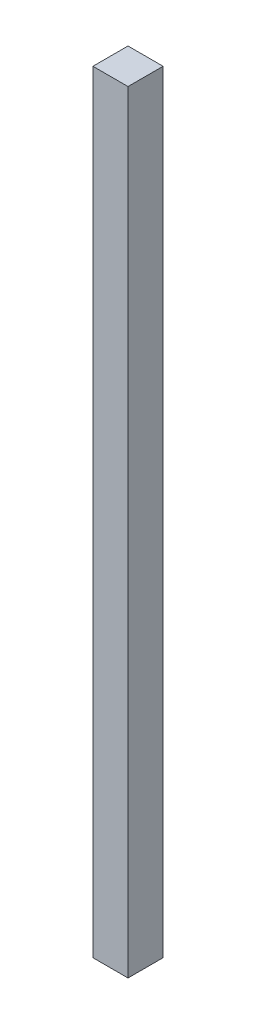
ISO-10303-21;
HEADER;
FILE_DESCRIPTION(('STEP AP214'),'2;1');
FILE_NAME('part.step','',(''),(''),'','','');
FILE_SCHEMA(('AUTOMOTIVE_DESIGN { 1 0 10303 214 1 1 1 1 }'));
ENDSEC;
DATA;
#1=APPLICATION_CONTEXT('core data for automotive mechanical design processes');
#2=APPLICATION_PROTOCOL_DEFINITION('international standard','automotive_design',2000,#1);
#3=PRODUCT_CONTEXT('',#1,'mechanical');
#4=PRODUCT('Part','Part','',(#3));
#5=PRODUCT_RELATED_PRODUCT_CATEGORY('part','',(#4));
#6=PRODUCT_DEFINITION_FORMATION('','',#4);
#7=PRODUCT_DEFINITION_CONTEXT('part definition',#1,'design');
#8=PRODUCT_DEFINITION('design','',#6,#7);
#9=PRODUCT_DEFINITION_SHAPE('','',#8);
#10=(LENGTH_UNIT() NAMED_UNIT(*) SI_UNIT(.MILLI.,.METRE.));
#11=(NAMED_UNIT(*) PLANE_ANGLE_UNIT() SI_UNIT($,.RADIAN.));
#12=(NAMED_UNIT(*) SI_UNIT($,.STERADIAN.) SOLID_ANGLE_UNIT());
#13=UNCERTAINTY_MEASURE_WITH_UNIT(LENGTH_MEASURE(1.E-05),#10,'distance_accuracy_value','');
#14=(GEOMETRIC_REPRESENTATION_CONTEXT(3) GLOBAL_UNCERTAINTY_ASSIGNED_CONTEXT((#13)) GLOBAL_UNIT_ASSIGNED_CONTEXT((#10,
#11,#12)) REPRESENTATION_CONTEXT('',''));
#15=CARTESIAN_POINT('',(0.,0.,0.));
#16=DIRECTION('',(0.,0.,1.));
#17=DIRECTION('',(1.,0.,0.));
#18=AXIS2_PLACEMENT_3D('',#15,#16,#17);
#19=CARTESIAN_POINT('',(0.,550.,0.));
#20=DIRECTION('',(1.,0.,0.));
#21=DIRECTION('',(0.,0.,-1.));
#22=AXIS2_PLACEMENT_3D('',#19,#20,#21);
#23=PLANE('',#22);
#24=DIRECTION('',(0.,0.,1.));
#25=VECTOR('',#24,1.);
#26=CARTESIAN_POINT('',(0.,0.,0.));
#27=LINE('',#26,#25);
#28=CARTESIAN_POINT('',(0.,0.,0.));
#29=VERTEX_POINT('',#28);
#30=CARTESIAN_POINT('',(0.,0.,25.));
#31=VERTEX_POINT('',#30);
#32=EDGE_CURVE('E99',#29,#31,#27,.T.);
#33=ORIENTED_EDGE('',*,*,#32,.F.);
#34=DIRECTION('',(0.,-1.,0.));
#35=VECTOR('',#34,1.);
#36=CARTESIAN_POINT('',(0.,550.,0.));
#37=LINE('',#36,#35);
#38=CARTESIAN_POINT('',(0.,550.,0.));
#39=VERTEX_POINT('',#38);
#40=EDGE_CURVE('E11',#39,#29,#37,.T.);
#41=ORIENTED_EDGE('',*,*,#40,.F.);
#42=DIRECTION('',(0.,0.,1.));
#43=VECTOR('',#42,1.);
#44=CARTESIAN_POINT('',(0.,550.,0.));
#45=LINE('',#44,#43);
#46=CARTESIAN_POINT('',(0.,550.,25.));
#47=VERTEX_POINT('',#46);
#48=EDGE_CURVE('E94',#39,#47,#45,.T.);
#49=ORIENTED_EDGE('',*,*,#48,.T.);
#50=DIRECTION('',(0.,-1.,0.));
#51=VECTOR('',#50,1.);
#52=CARTESIAN_POINT('',(0.,550.,25.));
#53=LINE('',#52,#51);
#54=EDGE_CURVE('E37',#47,#31,#53,.T.);
#55=ORIENTED_EDGE('',*,*,#54,.T.);
#56=EDGE_LOOP('',(#33,#41,#49,#55));
#57=FACE_BOUND('',#56,.T.);
#58=ADVANCED_FACE('F34',(#57),#23,.T.);
#59=CARTESIAN_POINT('',(0.,550.,0.));
#60=DIRECTION('',(0.,0.,1.));
#61=DIRECTION('',(1.,0.,0.));
#62=AXIS2_PLACEMENT_3D('',#59,#60,#61);
#63=PLANE('',#62);
#64=DIRECTION('',(-1.,0.,0.));
#65=VECTOR('',#64,1.);
#66=CARTESIAN_POINT('',(0.,0.,0.));
#67=LINE('',#66,#65);
#68=CARTESIAN_POINT('',(-25.,0.,0.));
#69=VERTEX_POINT('',#68);
#70=EDGE_CURVE('E67',#29,#69,#67,.T.);
#71=ORIENTED_EDGE('',*,*,#70,.T.);
#72=DIRECTION('',(0.,-1.,0.));
#73=VECTOR('',#72,1.);
#74=CARTESIAN_POINT('',(-25.,550.,0.));
#75=LINE('',#74,#73);
#76=CARTESIAN_POINT('',(-25.,550.,0.));
#77=VERTEX_POINT('',#76);
#78=EDGE_CURVE('E43',#77,#69,#75,.T.);
#79=ORIENTED_EDGE('',*,*,#78,.F.);
#80=DIRECTION('',(-1.,0.,0.));
#81=VECTOR('',#80,1.);
#82=CARTESIAN_POINT('',(0.,550.,0.));
#83=LINE('',#82,#81);
#84=EDGE_CURVE('E84',#39,#77,#83,.T.);
#85=ORIENTED_EDGE('',*,*,#84,.F.);
#86=ORIENTED_EDGE('',*,*,#40,.T.);
#87=EDGE_LOOP('',(#71,#79,#85,#86));
#88=FACE_BOUND('',#87,.T.);
#89=ADVANCED_FACE('F109',(#88),#63,.F.);
#90=CARTESIAN_POINT('',(-25.,550.,0.));
#91=DIRECTION('',(1.,0.,0.));
#92=DIRECTION('',(0.,0.,-1.));
#93=AXIS2_PLACEMENT_3D('',#90,#91,#92);
#94=PLANE('',#93);
#95=DIRECTION('',(0.,0.,1.));
#96=VECTOR('',#95,1.);
#97=CARTESIAN_POINT('',(-25.,0.,0.));
#98=LINE('',#97,#96);
#99=CARTESIAN_POINT('',(-25.,0.,25.));
#100=VERTEX_POINT('',#99);
#101=EDGE_CURVE('E91',#69,#100,#98,.T.);
#102=ORIENTED_EDGE('',*,*,#101,.T.);
#103=DIRECTION('',(0.,-1.,0.));
#104=VECTOR('',#103,1.);
#105=CARTESIAN_POINT('',(-25.,550.,25.));
#106=LINE('',#105,#104);
#107=CARTESIAN_POINT('',(-25.,550.,25.));
#108=VERTEX_POINT('',#107);
#109=EDGE_CURVE('E88',#108,#100,#106,.T.);
#110=ORIENTED_EDGE('',*,*,#109,.F.);
#111=DIRECTION('',(0.,0.,1.));
#112=VECTOR('',#111,1.);
#113=CARTESIAN_POINT('',(-25.,550.,0.));
#114=LINE('',#113,#112);
#115=EDGE_CURVE('E79',#77,#108,#114,.T.);
#116=ORIENTED_EDGE('',*,*,#115,.F.);
#117=ORIENTED_EDGE('',*,*,#78,.T.);
#118=EDGE_LOOP('',(#102,#110,#116,#117));
#119=FACE_BOUND('',#118,.T.);
#120=ADVANCED_FACE('F89',(#119),#94,.F.);
#121=CARTESIAN_POINT('',(0.,550.,25.));
#122=DIRECTION('',(0.,0.,1.));
#123=DIRECTION('',(1.,0.,0.));
#124=AXIS2_PLACEMENT_3D('',#121,#122,#123);
#125=PLANE('',#124);
#126=DIRECTION('',(-1.,0.,0.));
#127=VECTOR('',#126,1.);
#128=CARTESIAN_POINT('',(0.,0.,25.));
#129=LINE('',#128,#127);
#130=EDGE_CURVE('E102',#31,#100,#129,.T.);
#131=ORIENTED_EDGE('',*,*,#130,.F.);
#132=ORIENTED_EDGE('',*,*,#54,.F.);
#133=DIRECTION('',(-1.,0.,0.));
#134=VECTOR('',#133,1.);
#135=CARTESIAN_POINT('',(0.,550.,25.));
#136=LINE('',#135,#134);
#137=EDGE_CURVE('E83',#47,#108,#136,.T.);
#138=ORIENTED_EDGE('',*,*,#137,.T.);
#139=ORIENTED_EDGE('',*,*,#109,.T.);
#140=EDGE_LOOP('',(#131,#132,#138,#139));
#141=FACE_BOUND('',#140,.T.);
#142=ADVANCED_FACE('F93',(#141),#125,.T.);
#143=CARTESIAN_POINT('',(0.,550.,0.));
#144=DIRECTION('',(0.,-1.,0.));
#145=DIRECTION('',(0.,0.,-1.));
#146=AXIS2_PLACEMENT_3D('',#143,#144,#145);
#147=PLANE('',#146);
#148=ORIENTED_EDGE('',*,*,#48,.F.);
#149=ORIENTED_EDGE('',*,*,#84,.T.);
#150=ORIENTED_EDGE('',*,*,#115,.T.);
#151=ORIENTED_EDGE('',*,*,#137,.F.);
#152=EDGE_LOOP('',(#148,#149,#150,#151));
#153=FACE_BOUND('',#152,.T.);
#154=ADVANCED_FACE('F82',(#153),#147,.F.);
#155=CARTESIAN_POINT('',(0.,0.,0.));
#156=DIRECTION('',(0.,-1.,0.));
#157=DIRECTION('',(0.,0.,-1.));
#158=AXIS2_PLACEMENT_3D('',#155,#156,#157);
#159=PLANE('',#158);
#160=ORIENTED_EDGE('',*,*,#32,.T.);
#161=ORIENTED_EDGE('',*,*,#130,.T.);
#162=ORIENTED_EDGE('',*,*,#101,.F.);
#163=ORIENTED_EDGE('',*,*,#70,.F.);
#164=EDGE_LOOP('',(#160,#161,#162,#163));
#165=FACE_BOUND('',#164,.T.);
#166=ADVANCED_FACE('F107',(#165),#159,.T.);
#167=CLOSED_SHELL('',(#58,#89,#120,#142,#154,#166));
#168=MANIFOLD_SOLID_BREP('B2',#167);
#169=ADVANCED_BREP_SHAPE_REPRESENTATION('',(#18,#168),#14);
#170=SHAPE_DEFINITION_REPRESENTATION(#9,#169);
ENDSEC;
END-ISO-10303-21;
